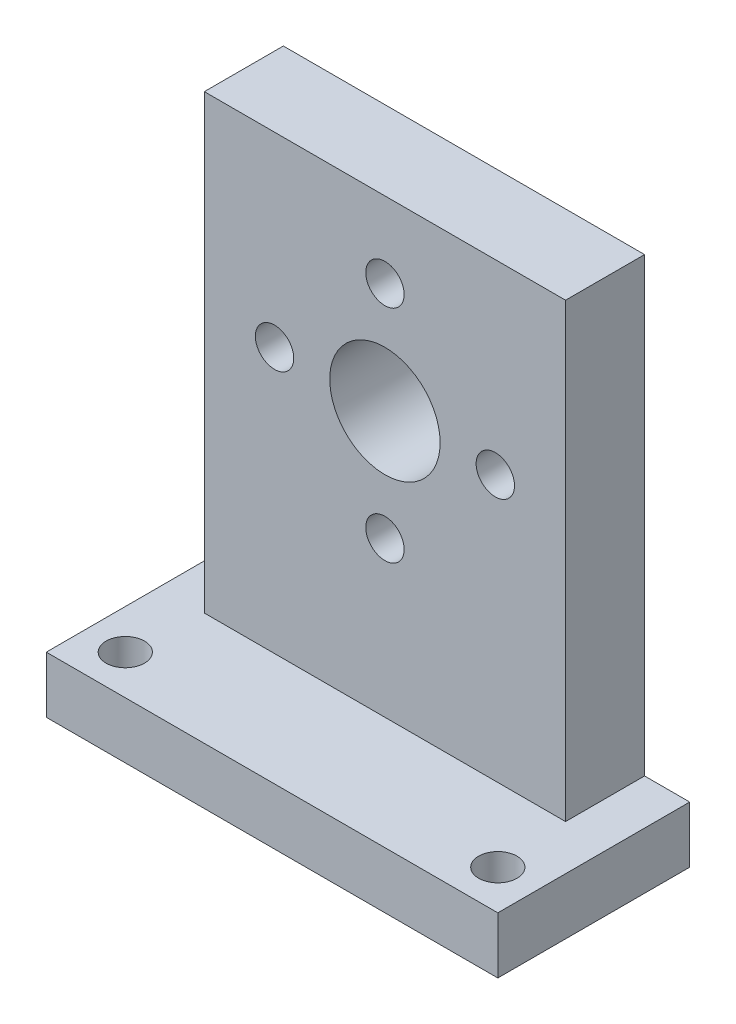
ISO-10303-21;
HEADER;
FILE_DESCRIPTION(('STEP AP214'),'2;1');
FILE_NAME('part.step','',(''),(''),'','','');
FILE_SCHEMA(('AUTOMOTIVE_DESIGN { 1 0 10303 214 1 1 1 1 }'));
ENDSEC;
DATA;
#1=APPLICATION_CONTEXT('core data for automotive mechanical design processes');
#2=APPLICATION_PROTOCOL_DEFINITION('international standard','automotive_design',2000,#1);
#3=PRODUCT_CONTEXT('',#1,'mechanical');
#4=PRODUCT('Part','Part','',(#3));
#5=PRODUCT_RELATED_PRODUCT_CATEGORY('part','',(#4));
#6=PRODUCT_DEFINITION_FORMATION('','',#4);
#7=PRODUCT_DEFINITION_CONTEXT('part definition',#1,'design');
#8=PRODUCT_DEFINITION('design','',#6,#7);
#9=PRODUCT_DEFINITION_SHAPE('','',#8);
#10=(LENGTH_UNIT() NAMED_UNIT(*) SI_UNIT(.MILLI.,.METRE.));
#11=(NAMED_UNIT(*) PLANE_ANGLE_UNIT() SI_UNIT($,.RADIAN.));
#12=(NAMED_UNIT(*) SI_UNIT($,.STERADIAN.) SOLID_ANGLE_UNIT());
#13=UNCERTAINTY_MEASURE_WITH_UNIT(LENGTH_MEASURE(1.E-05),#10,'distance_accuracy_value','');
#14=(GEOMETRIC_REPRESENTATION_CONTEXT(3) GLOBAL_UNCERTAINTY_ASSIGNED_CONTEXT((#13)) GLOBAL_UNIT_ASSIGNED_CONTEXT((#10,
#11,#12)) REPRESENTATION_CONTEXT('',''));
#15=CARTESIAN_POINT('',(0.,0.,0.));
#16=DIRECTION('',(0.,0.,1.));
#17=DIRECTION('',(1.,0.,0.));
#18=AXIS2_PLACEMENT_3D('',#15,#16,#17);
#19=CARTESIAN_POINT('',(-20.,5.,13.5));
#20=DIRECTION('',(0.,0.,-1.));
#21=DIRECTION('',(-1.,0.,0.));
#22=AXIS2_PLACEMENT_3D('',#19,#20,#21);
#23=PLANE('',#22);
#24=DIRECTION('',(1.,0.,0.));
#25=VECTOR('',#24,1.);
#26=CARTESIAN_POINT('',(-20.,0.,13.5));
#27=LINE('',#26,#25);
#28=CARTESIAN_POINT('',(-20.,0.,13.5));
#29=VERTEX_POINT('',#28);
#30=CARTESIAN_POINT('',(20.,0.,13.5));
#31=VERTEX_POINT('',#30);
#32=EDGE_CURVE('E121',#29,#31,#27,.T.);
#33=ORIENTED_EDGE('',*,*,#32,.T.);
#34=DIRECTION('',(0.,-1.,0.));
#35=VECTOR('',#34,1.);
#36=CARTESIAN_POINT('',(20.,5.,13.5));
#37=LINE('',#36,#35);
#38=CARTESIAN_POINT('',(20.,5.,13.5));
#39=VERTEX_POINT('',#38);
#40=EDGE_CURVE('E12',#39,#31,#37,.T.);
#41=ORIENTED_EDGE('',*,*,#40,.F.);
#42=DIRECTION('',(1.,0.,0.));
#43=VECTOR('',#42,1.);
#44=CARTESIAN_POINT('',(-20.,5.,13.5));
#45=LINE('',#44,#43);
#46=CARTESIAN_POINT('',(-20.,5.,13.5));
#47=VERTEX_POINT('',#46);
#48=EDGE_CURVE('E115',#47,#39,#45,.T.);
#49=ORIENTED_EDGE('',*,*,#48,.F.);
#50=DIRECTION('',(0.,-1.,0.));
#51=VECTOR('',#50,1.);
#52=CARTESIAN_POINT('',(-20.,5.,13.5));
#53=LINE('',#52,#51);
#54=EDGE_CURVE('E75',#47,#29,#53,.T.);
#55=ORIENTED_EDGE('',*,*,#54,.T.);
#56=EDGE_LOOP('',(#33,#41,#49,#55));
#57=FACE_BOUND('',#56,.T.);
#58=ADVANCED_FACE('F67',(#57),#23,.F.);
#59=CARTESIAN_POINT('',(20.,5.,-13.5));
#60=DIRECTION('',(1.,0.,0.));
#61=DIRECTION('',(0.,0.,-1.));
#62=AXIS2_PLACEMENT_3D('',#59,#60,#61);
#63=PLANE('',#62);
#64=DIRECTION('',(0.,1.,0.));
#65=VECTOR('',#64,1.);
#66=CARTESIAN_POINT('',(20.,-0.00100000000000013,-3.5));
#67=LINE('',#66,#65);
#68=CARTESIAN_POINT('',(20.,0.,-3.5));
#69=VERTEX_POINT('',#68);
#70=CARTESIAN_POINT('',(20.,5.,-3.5));
#71=VERTEX_POINT('',#70);
#72=EDGE_CURVE('E237',#69,#71,#67,.T.);
#73=ORIENTED_EDGE('',*,*,#72,.T.);
#74=DIRECTION('',(0.,0.,1.));
#75=VECTOR('',#74,1.);
#76=CARTESIAN_POINT('',(20.,5.,-13.5));
#77=LINE('',#76,#75);
#78=EDGE_CURVE('E136',#71,#39,#77,.T.);
#79=ORIENTED_EDGE('',*,*,#78,.T.);
#80=ORIENTED_EDGE('',*,*,#40,.T.);
#81=DIRECTION('',(0.,0.,1.));
#82=VECTOR('',#81,1.);
#83=CARTESIAN_POINT('',(20.,0.,-13.5));
#84=LINE('',#83,#82);
#85=EDGE_CURVE('E116',#69,#31,#84,.T.);
#86=ORIENTED_EDGE('',*,*,#85,.F.);
#87=EDGE_LOOP('',(#73,#79,#80,#86));
#88=FACE_BOUND('',#87,.T.);
#89=ADVANCED_FACE('F281',(#88),#63,.T.);
#90=CARTESIAN_POINT('',(-20.,5.,-13.5));
#91=DIRECTION('',(1.,0.,0.));
#92=DIRECTION('',(0.,0.,-1.));
#93=AXIS2_PLACEMENT_3D('',#90,#91,#92);
#94=PLANE('',#93);
#95=DIRECTION('',(0.,0.,1.));
#96=VECTOR('',#95,1.);
#97=CARTESIAN_POINT('',(-20.,5.,-13.5));
#98=LINE('',#97,#96);
#99=CARTESIAN_POINT('',(-20.,5.,-3.5));
#100=VERTEX_POINT('',#99);
#101=EDGE_CURVE('E90',#100,#47,#98,.T.);
#102=ORIENTED_EDGE('',*,*,#101,.F.);
#103=DIRECTION('',(0.,1.,0.));
#104=VECTOR('',#103,1.);
#105=CARTESIAN_POINT('',(-20.,-0.00100000000000013,-3.5));
#106=LINE('',#105,#104);
#107=CARTESIAN_POINT('',(-20.,0.,-3.5));
#108=VERTEX_POINT('',#107);
#109=EDGE_CURVE('E110',#108,#100,#106,.T.);
#110=ORIENTED_EDGE('',*,*,#109,.F.);
#111=DIRECTION('',(0.,0.,1.));
#112=VECTOR('',#111,1.);
#113=CARTESIAN_POINT('',(-20.,0.,-13.5));
#114=LINE('',#113,#112);
#115=EDGE_CURVE('E104',#108,#29,#114,.T.);
#116=ORIENTED_EDGE('',*,*,#115,.T.);
#117=ORIENTED_EDGE('',*,*,#54,.F.);
#118=EDGE_LOOP('',(#102,#110,#116,#117));
#119=FACE_BOUND('',#118,.T.);
#120=ADVANCED_FACE('F106',(#119),#94,.F.);
#121=CARTESIAN_POINT('',(0.,5.,0.));
#122=DIRECTION('',(0.,-1.,0.));
#123=DIRECTION('',(0.,0.,-1.));
#124=AXIS2_PLACEMENT_3D('',#121,#122,#123);
#125=PLANE('',#124);
#126=CARTESIAN_POINT('',(16.5,5.,10.));
#127=DIRECTION('',(0.,1.,0.));
#128=DIRECTION('',(0.,0.,-1.));
#129=AXIS2_PLACEMENT_3D('',#126,#127,#128);
#130=CIRCLE('',#129,1.7);
#131=CARTESIAN_POINT('',(16.5,5.,8.3));
#132=VERTEX_POINT('',#131);
#133=EDGE_CURVE('E219',#132,#132,#130,.T.);
#134=ORIENTED_EDGE('',*,*,#133,.F.);
#135=EDGE_LOOP('',(#134));
#136=FACE_BOUND('',#135,.T.);
#137=CARTESIAN_POINT('',(-16.5,5.,10.));
#138=DIRECTION('',(0.,1.,0.));
#139=DIRECTION('',(0.,0.,1.));
#140=AXIS2_PLACEMENT_3D('',#137,#138,#139);
#141=CIRCLE('',#140,1.7);
#142=CARTESIAN_POINT('',(-16.5,5.,11.7));
#143=VERTEX_POINT('',#142);
#144=EDGE_CURVE('E228',#143,#143,#141,.T.);
#145=ORIENTED_EDGE('',*,*,#144,.F.);
#146=EDGE_LOOP('',(#145));
#147=FACE_BOUND('',#146,.T.);
#148=ORIENTED_EDGE('',*,*,#78,.F.);
#149=DIRECTION('',(1.,0.,0.));
#150=VECTOR('',#149,1.);
#151=CARTESIAN_POINT('',(-20.,5.,-3.5));
#152=LINE('',#151,#150);
#153=CARTESIAN_POINT('',(16.,5.,-3.5));
#154=VERTEX_POINT('',#153);
#155=EDGE_CURVE('E247',#154,#71,#152,.T.);
#156=ORIENTED_EDGE('',*,*,#155,.F.);
#157=DIRECTION('',(0.,0.,1.));
#158=VECTOR('',#157,1.);
#159=CARTESIAN_POINT('',(16.,5.,0.));
#160=LINE('',#159,#158);
#161=CARTESIAN_POINT('',(16.,5.00000000000001,3.5));
#162=VERTEX_POINT('',#161);
#163=EDGE_CURVE('E143',#154,#162,#160,.T.);
#164=ORIENTED_EDGE('',*,*,#163,.T.);
#165=DIRECTION('',(1.,0.,0.));
#166=VECTOR('',#165,1.);
#167=CARTESIAN_POINT('',(0.,5.,3.5));
#168=LINE('',#167,#166);
#169=CARTESIAN_POINT('',(-16.,5.,3.5));
#170=VERTEX_POINT('',#169);
#171=EDGE_CURVE('E82',#170,#162,#168,.T.);
#172=ORIENTED_EDGE('',*,*,#171,.F.);
#173=DIRECTION('',(0.,0.,1.));
#174=VECTOR('',#173,1.);
#175=CARTESIAN_POINT('',(-16.,5.,0.));
#176=LINE('',#175,#174);
#177=CARTESIAN_POINT('',(-16.,5.,-3.5));
#178=VERTEX_POINT('',#177);
#179=EDGE_CURVE('E131',#178,#170,#176,.T.);
#180=ORIENTED_EDGE('',*,*,#179,.F.);
#181=EDGE_CURVE('E240',#100,#178,#152,.T.);
#182=ORIENTED_EDGE('',*,*,#181,.F.);
#183=ORIENTED_EDGE('',*,*,#101,.T.);
#184=ORIENTED_EDGE('',*,*,#48,.T.);
#185=EDGE_LOOP('',(#148,#156,#164,#172,#180,#182,#183,#184));
#186=FACE_BOUND('',#185,.T.);
#187=ADVANCED_FACE('F282',(#136,#147,#186),#125,.F.);
#188=CARTESIAN_POINT('',(0.,0.,0.));
#189=DIRECTION('',(0.,-1.,0.));
#190=DIRECTION('',(0.,0.,-1.));
#191=AXIS2_PLACEMENT_3D('',#188,#189,#190);
#192=PLANE('',#191);
#193=DIRECTION('',(1.,0.,0.));
#194=VECTOR('',#193,1.);
#195=CARTESIAN_POINT('',(-20.,0.,-3.5));
#196=LINE('',#195,#194);
#197=EDGE_CURVE('E224',#108,#69,#196,.T.);
#198=ORIENTED_EDGE('',*,*,#197,.T.);
#199=ORIENTED_EDGE('',*,*,#85,.T.);
#200=ORIENTED_EDGE('',*,*,#32,.F.);
#201=ORIENTED_EDGE('',*,*,#115,.F.);
#202=EDGE_LOOP('',(#198,#199,#200,#201));
#203=FACE_BOUND('',#202,.T.);
#204=CARTESIAN_POINT('',(16.5,0.,10.));
#205=DIRECTION('',(0.,-1.,0.));
#206=DIRECTION('',(0.,0.,-1.));
#207=AXIS2_PLACEMENT_3D('',#204,#205,#206);
#208=CIRCLE('',#207,1.7);
#209=CARTESIAN_POINT('',(16.5,0.,8.3));
#210=VERTEX_POINT('',#209);
#211=EDGE_CURVE('E223',#210,#210,#208,.F.);
#212=ORIENTED_EDGE('',*,*,#211,.T.);
#213=EDGE_LOOP('',(#212));
#214=FACE_BOUND('',#213,.T.);
#215=CARTESIAN_POINT('',(-16.5,0.,10.));
#216=DIRECTION('',(0.,-1.,0.));
#217=DIRECTION('',(0.,0.,-1.));
#218=AXIS2_PLACEMENT_3D('',#215,#216,#217);
#219=CIRCLE('',#218,1.7);
#220=CARTESIAN_POINT('',(-16.5,0.,8.30000000000001));
#221=VERTEX_POINT('',#220);
#222=EDGE_CURVE('E192',#221,#221,#219,.F.);
#223=ORIENTED_EDGE('',*,*,#222,.T.);
#224=EDGE_LOOP('',(#223));
#225=FACE_BOUND('',#224,.T.);
#226=ADVANCED_FACE('F123',(#203,#214,#225),#192,.T.);
#227=CARTESIAN_POINT('',(0.,45.,-3.5));
#228=DIRECTION('',(0.,0.,-1.));
#229=DIRECTION('',(-1.,0.,0.));
#230=AXIS2_PLACEMENT_3D('',#227,#228,#229);
#231=PLANE('',#230);
#232=CARTESIAN_POINT('',(9.779,2.5,-3.5));
#233=DIRECTION('',(0.,0.,-1.));
#234=DIRECTION('',(-1.,0.,0.));
#235=AXIS2_PLACEMENT_3D('',#232,#233,#234);
#236=CIRCLE('',#235,1.7);
#237=CARTESIAN_POINT('',(8.079,2.5,-3.5));
#238=VERTEX_POINT('',#237);
#239=EDGE_CURVE('E256',#238,#238,#236,.T.);
#240=ORIENTED_EDGE('',*,*,#239,.F.);
#241=EDGE_LOOP('',(#240));
#242=FACE_BOUND('',#241,.T.);
#243=CARTESIAN_POINT('',(-9.779,2.5,-3.5));
#244=DIRECTION('',(0.,0.,-1.));
#245=DIRECTION('',(1.,0.,0.));
#246=AXIS2_PLACEMENT_3D('',#243,#244,#245);
#247=CIRCLE('',#246,1.7);
#248=CARTESIAN_POINT('',(-8.079,2.5,-3.5));
#249=VERTEX_POINT('',#248);
#250=EDGE_CURVE('E252',#249,#249,#247,.T.);
#251=ORIENTED_EDGE('',*,*,#250,.F.);
#252=EDGE_LOOP('',(#251));
#253=FACE_BOUND('',#252,.T.);
#254=CARTESIAN_POINT('',(0.,38.279,-3.5));
#255=DIRECTION('',(0.,0.,-1.));
#256=DIRECTION('',(-1.,0.,0.));
#257=AXIS2_PLACEMENT_3D('',#254,#255,#256);
#258=CIRCLE('',#257,1.7);
#259=CARTESIAN_POINT('',(-1.7,38.279,-3.5));
#260=VERTEX_POINT('',#259);
#261=EDGE_CURVE('E212',#260,#260,#258,.F.);
#262=ORIENTED_EDGE('',*,*,#261,.T.);
#263=EDGE_LOOP('',(#262));
#264=FACE_BOUND('',#263,.T.);
#265=CARTESIAN_POINT('',(9.779,28.5,-3.5));
#266=DIRECTION('',(0.,0.,-1.));
#267=DIRECTION('',(-1.,0.,0.));
#268=AXIS2_PLACEMENT_3D('',#265,#266,#267);
#269=CIRCLE('',#268,1.7);
#270=CARTESIAN_POINT('',(8.079,28.5,-3.5));
#271=VERTEX_POINT('',#270);
#272=EDGE_CURVE('E208',#271,#271,#269,.F.);
#273=ORIENTED_EDGE('',*,*,#272,.T.);
#274=EDGE_LOOP('',(#273));
#275=FACE_BOUND('',#274,.T.);
#276=CARTESIAN_POINT('',(0.,18.721,-3.5));
#277=DIRECTION('',(0.,0.,-1.));
#278=DIRECTION('',(-1.,0.,0.));
#279=AXIS2_PLACEMENT_3D('',#276,#277,#278);
#280=CIRCLE('',#279,1.7);
#281=CARTESIAN_POINT('',(-1.7,18.721,-3.5));
#282=VERTEX_POINT('',#281);
#283=EDGE_CURVE('E200',#282,#282,#280,.F.);
#284=ORIENTED_EDGE('',*,*,#283,.T.);
#285=EDGE_LOOP('',(#284));
#286=FACE_BOUND('',#285,.T.);
#287=CARTESIAN_POINT('',(-9.779,28.5,-3.5));
#288=DIRECTION('',(0.,0.,-1.));
#289=DIRECTION('',(-1.,0.,0.));
#290=AXIS2_PLACEMENT_3D('',#287,#288,#289);
#291=CIRCLE('',#290,1.7);
#292=CARTESIAN_POINT('',(-11.479,28.5,-3.5));
#293=VERTEX_POINT('',#292);
#294=EDGE_CURVE('E191',#293,#293,#291,.F.);
#295=ORIENTED_EDGE('',*,*,#294,.T.);
#296=EDGE_LOOP('',(#295));
#297=FACE_BOUND('',#296,.T.);
#298=CARTESIAN_POINT('',(0.,28.5,-3.5));
#299=DIRECTION('',(0.,0.,-1.));
#300=DIRECTION('',(-1.,0.,0.));
#301=AXIS2_PLACEMENT_3D('',#298,#299,#300);
#302=CIRCLE('',#301,4.8895);
#303=CARTESIAN_POINT('',(-4.8895,28.5,-3.5));
#304=VERTEX_POINT('',#303);
#305=EDGE_CURVE('E179',#304,#304,#302,.F.);
#306=ORIENTED_EDGE('',*,*,#305,.T.);
#307=EDGE_LOOP('',(#306));
#308=FACE_BOUND('',#307,.T.);
#309=DIRECTION('',(0.,-1.,0.));
#310=VECTOR('',#309,1.);
#311=CARTESIAN_POINT('',(16.,45.,-3.5));
#312=LINE('',#311,#310);
#313=CARTESIAN_POINT('',(16.,45.,-3.5));
#314=VERTEX_POINT('',#313);
#315=EDGE_CURVE('E146',#314,#154,#312,.T.);
#316=ORIENTED_EDGE('',*,*,#315,.T.);
#317=ORIENTED_EDGE('',*,*,#155,.T.);
#318=ORIENTED_EDGE('',*,*,#72,.F.);
#319=ORIENTED_EDGE('',*,*,#197,.F.);
#320=ORIENTED_EDGE('',*,*,#109,.T.);
#321=ORIENTED_EDGE('',*,*,#181,.T.);
#322=DIRECTION('',(0.,-1.,0.));
#323=VECTOR('',#322,1.);
#324=CARTESIAN_POINT('',(-16.,45.,-3.5));
#325=LINE('',#324,#323);
#326=CARTESIAN_POINT('',(-16.,45.,-3.5));
#327=VERTEX_POINT('',#326);
#328=EDGE_CURVE('E150',#327,#178,#325,.T.);
#329=ORIENTED_EDGE('',*,*,#328,.F.);
#330=DIRECTION('',(1.,0.,0.));
#331=VECTOR('',#330,1.);
#332=CARTESIAN_POINT('',(0.,45.,-3.5));
#333=LINE('',#332,#331);
#334=EDGE_CURVE('E170',#327,#314,#333,.T.);
#335=ORIENTED_EDGE('',*,*,#334,.T.);
#336=EDGE_LOOP('',(#316,#317,#318,#319,#320,#321,#329,#335));
#337=FACE_BOUND('',#336,.T.);
#338=ADVANCED_FACE('F271',(#242,#253,#264,#275,#286,#297,#308,#337),#231,.T.);
#339=CARTESIAN_POINT('',(0.,45.,3.5));
#340=DIRECTION('',(0.,0.,-1.));
#341=DIRECTION('',(-1.,0.,0.));
#342=AXIS2_PLACEMENT_3D('',#339,#340,#341);
#343=PLANE('',#342);
#344=CARTESIAN_POINT('',(0.,38.279,3.5));
#345=DIRECTION('',(0.,0.,1.));
#346=DIRECTION('',(1.,0.,0.));
#347=AXIS2_PLACEMENT_3D('',#344,#345,#346);
#348=CIRCLE('',#347,1.7);
#349=CARTESIAN_POINT('',(1.7,38.279,3.5));
#350=VERTEX_POINT('',#349);
#351=EDGE_CURVE('E183',#350,#350,#348,.T.);
#352=ORIENTED_EDGE('',*,*,#351,.F.);
#353=EDGE_LOOP('',(#352));
#354=FACE_BOUND('',#353,.T.);
#355=CARTESIAN_POINT('',(9.779,28.5,3.5));
#356=DIRECTION('',(0.,0.,1.));
#357=DIRECTION('',(1.,0.,0.));
#358=AXIS2_PLACEMENT_3D('',#355,#356,#357);
#359=CIRCLE('',#358,1.7);
#360=CARTESIAN_POINT('',(11.479,28.5,3.5));
#361=VERTEX_POINT('',#360);
#362=EDGE_CURVE('E204',#361,#361,#359,.T.);
#363=ORIENTED_EDGE('',*,*,#362,.F.);
#364=EDGE_LOOP('',(#363));
#365=FACE_BOUND('',#364,.T.);
#366=CARTESIAN_POINT('',(0.,18.721,3.5));
#367=DIRECTION('',(0.,0.,1.));
#368=DIRECTION('',(1.,0.,0.));
#369=AXIS2_PLACEMENT_3D('',#366,#367,#368);
#370=CIRCLE('',#369,1.7);
#371=CARTESIAN_POINT('',(1.7,18.721,3.5));
#372=VERTEX_POINT('',#371);
#373=EDGE_CURVE('E196',#372,#372,#370,.T.);
#374=ORIENTED_EDGE('',*,*,#373,.F.);
#375=EDGE_LOOP('',(#374));
#376=FACE_BOUND('',#375,.T.);
#377=CARTESIAN_POINT('',(-9.779,28.5,3.5));
#378=DIRECTION('',(0.,0.,1.));
#379=DIRECTION('',(1.,0.,0.));
#380=AXIS2_PLACEMENT_3D('',#377,#378,#379);
#381=CIRCLE('',#380,1.7);
#382=CARTESIAN_POINT('',(-8.079,28.5,3.5));
#383=VERTEX_POINT('',#382);
#384=EDGE_CURVE('E187',#383,#383,#381,.T.);
#385=ORIENTED_EDGE('',*,*,#384,.F.);
#386=EDGE_LOOP('',(#385));
#387=FACE_BOUND('',#386,.T.);
#388=CARTESIAN_POINT('',(0.,28.5,3.5));
#389=DIRECTION('',(0.,0.,1.));
#390=DIRECTION('',(1.,0.,0.));
#391=AXIS2_PLACEMENT_3D('',#388,#389,#390);
#392=CIRCLE('',#391,4.8895);
#393=CARTESIAN_POINT('',(4.8895,28.5,3.5));
#394=VERTEX_POINT('',#393);
#395=EDGE_CURVE('E178',#394,#394,#392,.T.);
#396=ORIENTED_EDGE('',*,*,#395,.F.);
#397=EDGE_LOOP('',(#396));
#398=FACE_BOUND('',#397,.T.);
#399=DIRECTION('',(0.,-1.,0.));
#400=VECTOR('',#399,1.);
#401=CARTESIAN_POINT('',(-16.,45.,3.5));
#402=LINE('',#401,#400);
#403=CARTESIAN_POINT('',(-16.,45.,3.5));
#404=VERTEX_POINT('',#403);
#405=EDGE_CURVE('E154',#404,#170,#402,.T.);
#406=ORIENTED_EDGE('',*,*,#405,.T.);
#407=ORIENTED_EDGE('',*,*,#171,.T.);
#408=DIRECTION('',(0.,-1.,0.));
#409=VECTOR('',#408,1.);
#410=CARTESIAN_POINT('',(16.,45.,3.5));
#411=LINE('',#410,#409);
#412=CARTESIAN_POINT('',(16.,45.,3.5));
#413=VERTEX_POINT('',#412);
#414=EDGE_CURVE('E158',#413,#162,#411,.T.);
#415=ORIENTED_EDGE('',*,*,#414,.F.);
#416=DIRECTION('',(1.,0.,0.));
#417=VECTOR('',#416,1.);
#418=CARTESIAN_POINT('',(0.,45.,3.5));
#419=LINE('',#418,#417);
#420=EDGE_CURVE('E162',#404,#413,#419,.T.);
#421=ORIENTED_EDGE('',*,*,#420,.F.);
#422=EDGE_LOOP('',(#406,#407,#415,#421));
#423=FACE_BOUND('',#422,.T.);
#424=ADVANCED_FACE('F332',(#354,#365,#376,#387,#398,#423),#343,.F.);
#425=CARTESIAN_POINT('',(16.,45.,0.));
#426=DIRECTION('',(1.,0.,0.));
#427=DIRECTION('',(0.,0.,-1.));
#428=AXIS2_PLACEMENT_3D('',#425,#426,#427);
#429=PLANE('',#428);
#430=ORIENTED_EDGE('',*,*,#163,.F.);
#431=ORIENTED_EDGE('',*,*,#315,.F.);
#432=DIRECTION('',(0.,0.,1.));
#433=VECTOR('',#432,1.);
#434=CARTESIAN_POINT('',(16.,45.,0.));
#435=LINE('',#434,#433);
#436=EDGE_CURVE('E174',#314,#413,#435,.T.);
#437=ORIENTED_EDGE('',*,*,#436,.T.);
#438=ORIENTED_EDGE('',*,*,#414,.T.);
#439=EDGE_LOOP('',(#430,#431,#437,#438));
#440=FACE_BOUND('',#439,.T.);
#441=ADVANCED_FACE('F326',(#440),#429,.T.);
#442=CARTESIAN_POINT('',(-16.,45.,0.));
#443=DIRECTION('',(1.,0.,0.));
#444=DIRECTION('',(0.,0.,-1.));
#445=AXIS2_PLACEMENT_3D('',#442,#443,#444);
#446=PLANE('',#445);
#447=ORIENTED_EDGE('',*,*,#328,.T.);
#448=ORIENTED_EDGE('',*,*,#179,.T.);
#449=ORIENTED_EDGE('',*,*,#405,.F.);
#450=DIRECTION('',(0.,0.,1.));
#451=VECTOR('',#450,1.);
#452=CARTESIAN_POINT('',(-16.,45.,0.));
#453=LINE('',#452,#451);
#454=EDGE_CURVE('E166',#327,#404,#453,.T.);
#455=ORIENTED_EDGE('',*,*,#454,.F.);
#456=EDGE_LOOP('',(#447,#448,#449,#455));
#457=FACE_BOUND('',#456,.T.);
#458=ADVANCED_FACE('F331',(#457),#446,.F.);
#459=CARTESIAN_POINT('',(0.,45.,0.));
#460=DIRECTION('',(0.,1.,0.));
#461=DIRECTION('',(0.,0.,1.));
#462=AXIS2_PLACEMENT_3D('',#459,#460,#461);
#463=PLANE('',#462);
#464=ORIENTED_EDGE('',*,*,#436,.F.);
#465=ORIENTED_EDGE('',*,*,#334,.F.);
#466=ORIENTED_EDGE('',*,*,#454,.T.);
#467=ORIENTED_EDGE('',*,*,#420,.T.);
#468=EDGE_LOOP('',(#464,#465,#466,#467));
#469=FACE_BOUND('',#468,.T.);
#470=ADVANCED_FACE('F344',(#469),#463,.T.);
#471=CARTESIAN_POINT('',(0.,28.5,-13.501));
#472=DIRECTION('',(0.,0.,1.));
#473=DIRECTION('',(1.,0.,0.));
#474=AXIS2_PLACEMENT_3D('',#471,#472,#473);
#475=CYLINDRICAL_SURFACE('',#474,4.8895);
#476=ORIENTED_EDGE('',*,*,#305,.F.);
#477=EDGE_LOOP('',(#476));
#478=FACE_BOUND('',#477,.T.);
#479=ORIENTED_EDGE('',*,*,#395,.T.);
#480=EDGE_LOOP('',(#479));
#481=FACE_BOUND('',#480,.T.);
#482=ADVANCED_FACE('F462',(#478,#481),#475,.F.);
#483=CARTESIAN_POINT('',(-9.779,28.5,-13.501));
#484=DIRECTION('',(0.,0.,1.));
#485=DIRECTION('',(1.,0.,0.));
#486=AXIS2_PLACEMENT_3D('',#483,#484,#485);
#487=CYLINDRICAL_SURFACE('',#486,1.7);
#488=ORIENTED_EDGE('',*,*,#294,.F.);
#489=EDGE_LOOP('',(#488));
#490=FACE_BOUND('',#489,.T.);
#491=ORIENTED_EDGE('',*,*,#384,.T.);
#492=EDGE_LOOP('',(#491));
#493=FACE_BOUND('',#492,.T.);
#494=ADVANCED_FACE('F452',(#490,#493),#487,.F.);
#495=CARTESIAN_POINT('',(0.,18.721,-13.501));
#496=DIRECTION('',(0.,0.,1.));
#497=DIRECTION('',(1.,0.,0.));
#498=AXIS2_PLACEMENT_3D('',#495,#496,#497);
#499=CYLINDRICAL_SURFACE('',#498,1.7);
#500=ORIENTED_EDGE('',*,*,#283,.F.);
#501=EDGE_LOOP('',(#500));
#502=FACE_BOUND('',#501,.T.);
#503=ORIENTED_EDGE('',*,*,#373,.T.);
#504=EDGE_LOOP('',(#503));
#505=FACE_BOUND('',#504,.T.);
#506=ADVANCED_FACE('F442',(#502,#505),#499,.F.);
#507=CARTESIAN_POINT('',(9.779,28.5,-13.501));
#508=DIRECTION('',(0.,0.,1.));
#509=DIRECTION('',(1.,0.,0.));
#510=AXIS2_PLACEMENT_3D('',#507,#508,#509);
#511=CYLINDRICAL_SURFACE('',#510,1.7);
#512=ORIENTED_EDGE('',*,*,#272,.F.);
#513=EDGE_LOOP('',(#512));
#514=FACE_BOUND('',#513,.T.);
#515=ORIENTED_EDGE('',*,*,#362,.T.);
#516=EDGE_LOOP('',(#515));
#517=FACE_BOUND('',#516,.T.);
#518=ADVANCED_FACE('F432',(#514,#517),#511,.F.);
#519=CARTESIAN_POINT('',(0.,38.279,-13.501));
#520=DIRECTION('',(0.,0.,1.));
#521=DIRECTION('',(1.,0.,0.));
#522=AXIS2_PLACEMENT_3D('',#519,#520,#521);
#523=CYLINDRICAL_SURFACE('',#522,1.7);
#524=ORIENTED_EDGE('',*,*,#261,.F.);
#525=EDGE_LOOP('',(#524));
#526=FACE_BOUND('',#525,.T.);
#527=ORIENTED_EDGE('',*,*,#351,.T.);
#528=EDGE_LOOP('',(#527));
#529=FACE_BOUND('',#528,.T.);
#530=ADVANCED_FACE('F422',(#526,#529),#523,.F.);
#531=CARTESIAN_POINT('',(-16.5,-0.00100000000000013,10.));
#532=DIRECTION('',(0.,1.,0.));
#533=DIRECTION('',(0.,0.,1.));
#534=AXIS2_PLACEMENT_3D('',#531,#532,#533);
#535=CYLINDRICAL_SURFACE('',#534,1.7);
#536=ORIENTED_EDGE('',*,*,#222,.F.);
#537=EDGE_LOOP('',(#536));
#538=FACE_BOUND('',#537,.T.);
#539=ORIENTED_EDGE('',*,*,#144,.T.);
#540=EDGE_LOOP('',(#539));
#541=FACE_BOUND('',#540,.T.);
#542=ADVANCED_FACE('F413',(#538,#541),#535,.F.);
#543=CARTESIAN_POINT('',(16.5,-0.00100000000000013,10.));
#544=DIRECTION('',(0.,1.,0.));
#545=DIRECTION('',(0.,0.,1.));
#546=AXIS2_PLACEMENT_3D('',#543,#544,#545);
#547=CYLINDRICAL_SURFACE('',#546,1.7);
#548=ORIENTED_EDGE('',*,*,#211,.F.);
#549=EDGE_LOOP('',(#548));
#550=FACE_BOUND('',#549,.T.);
#551=ORIENTED_EDGE('',*,*,#133,.T.);
#552=EDGE_LOOP('',(#551));
#553=FACE_BOUND('',#552,.T.);
#554=ADVANCED_FACE('F368',(#550,#553),#547,.F.);
#555=CARTESIAN_POINT('',(-9.779,2.5,2.85));
#556=DIRECTION('',(0.,0.,-1.));
#557=DIRECTION('',(-1.,0.,0.));
#558=AXIS2_PLACEMENT_3D('',#555,#556,#557);
#559=CYLINDRICAL_SURFACE('',#558,1.7);
#560=CARTESIAN_POINT('',(-9.779,2.5,2.85));
#561=DIRECTION('',(0.,0.,-1.));
#562=DIRECTION('',(1.,0.,0.));
#563=AXIS2_PLACEMENT_3D('',#560,#561,#562);
#564=CIRCLE('',#563,1.7);
#565=CARTESIAN_POINT('',(-8.079,2.5,2.85));
#566=VERTEX_POINT('',#565);
#567=EDGE_CURVE('E248',#566,#566,#564,.T.);
#568=ORIENTED_EDGE('',*,*,#567,.F.);
#569=EDGE_LOOP('',(#568));
#570=FACE_BOUND('',#569,.T.);
#571=ORIENTED_EDGE('',*,*,#250,.T.);
#572=EDGE_LOOP('',(#571));
#573=FACE_BOUND('',#572,.T.);
#574=ADVANCED_FACE('F363',(#570,#573),#559,.F.);
#575=CARTESIAN_POINT('',(-9.779,2.5,2.85));
#576=DIRECTION('',(0.,0.,1.));
#577=DIRECTION('',(1.,0.,0.));
#578=AXIS2_PLACEMENT_3D('',#575,#576,#577);
#579=PLANE('',#578);
#580=ORIENTED_EDGE('',*,*,#567,.T.);
#581=EDGE_LOOP('',(#580));
#582=FACE_BOUND('',#581,.T.);
#583=ADVANCED_FACE('F367',(#582),#579,.F.);
#584=CARTESIAN_POINT('',(9.779,2.5,2.85));
#585=DIRECTION('',(0.,0.,-1.));
#586=DIRECTION('',(-1.,0.,0.));
#587=AXIS2_PLACEMENT_3D('',#584,#585,#586);
#588=CYLINDRICAL_SURFACE('',#587,1.7);
#589=CARTESIAN_POINT('',(9.779,2.5,2.85));
#590=DIRECTION('',(0.,0.,-1.));
#591=DIRECTION('',(-1.,0.,0.));
#592=AXIS2_PLACEMENT_3D('',#589,#590,#591);
#593=CIRCLE('',#592,1.7);
#594=CARTESIAN_POINT('',(8.079,2.5,2.85));
#595=VERTEX_POINT('',#594);
#596=EDGE_CURVE('E260',#595,#595,#593,.T.);
#597=ORIENTED_EDGE('',*,*,#596,.F.);
#598=EDGE_LOOP('',(#597));
#599=FACE_BOUND('',#598,.T.);
#600=ORIENTED_EDGE('',*,*,#239,.T.);
#601=EDGE_LOOP('',(#600));
#602=FACE_BOUND('',#601,.T.);
#603=ADVANCED_FACE('F380',(#599,#602),#588,.F.);
#604=CARTESIAN_POINT('',(9.779,2.5,2.85));
#605=DIRECTION('',(0.,0.,-1.));
#606=DIRECTION('',(-1.,0.,0.));
#607=AXIS2_PLACEMENT_3D('',#604,#605,#606);
#608=PLANE('',#607);
#609=ORIENTED_EDGE('',*,*,#596,.T.);
#610=EDGE_LOOP('',(#609));
#611=FACE_BOUND('',#610,.T.);
#612=ADVANCED_FACE('F391',(#611),#608,.T.);
#613=CLOSED_SHELL('',(#58,#89,#120,#187,#226,#338,#424,#441,#458,#470,#482,#494,#506,#518,#530,
#542,#554,#574,#583,#603,#612));
#614=MANIFOLD_SOLID_BREP('B2',#613);
#615=ADVANCED_BREP_SHAPE_REPRESENTATION('',(#18,#614),#14);
#616=SHAPE_DEFINITION_REPRESENTATION(#9,#615);
ENDSEC;
END-ISO-10303-21;
